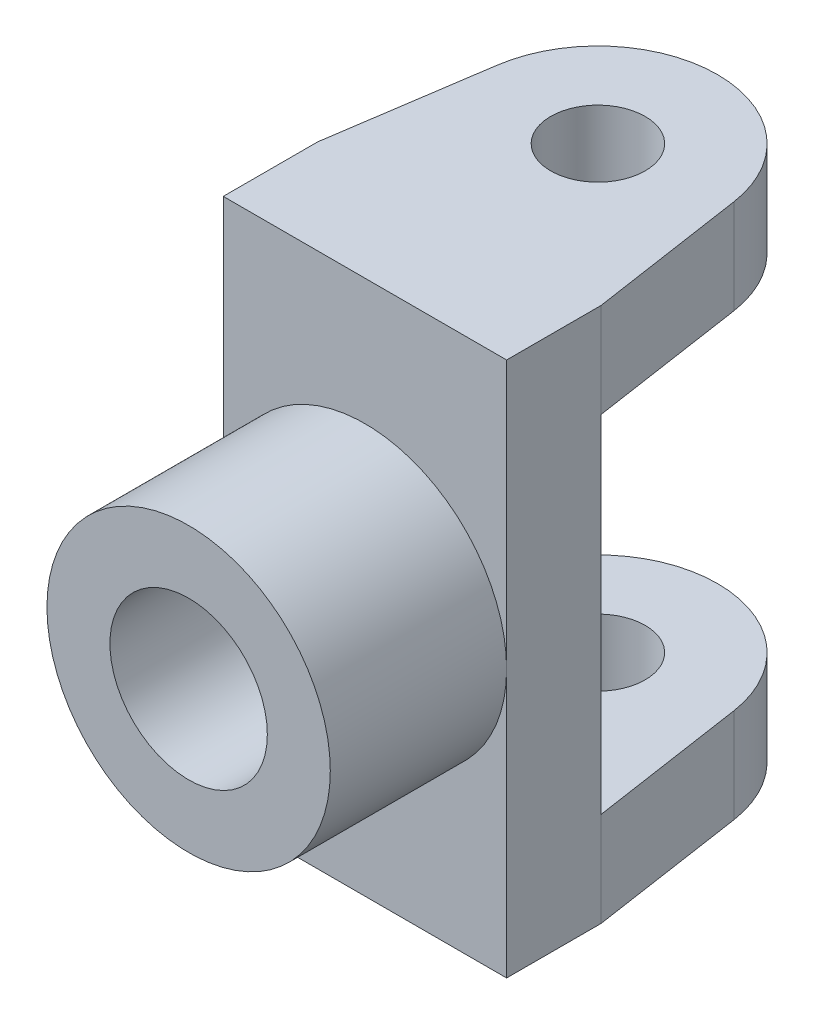
ISO-10303-21;
HEADER;
FILE_DESCRIPTION(('STEP AP214'),'2;1');
FILE_NAME('part.step','',(''),(''),'','','');
FILE_SCHEMA(('AUTOMOTIVE_DESIGN { 1 0 10303 214 1 1 1 1 }'));
ENDSEC;
DATA;
#1=APPLICATION_CONTEXT('core data for automotive mechanical design processes');
#2=APPLICATION_PROTOCOL_DEFINITION('international standard','automotive_design',2000,#1);
#3=PRODUCT_CONTEXT('',#1,'mechanical');
#4=PRODUCT('Part','Part','',(#3));
#5=PRODUCT_RELATED_PRODUCT_CATEGORY('part','',(#4));
#6=PRODUCT_DEFINITION_FORMATION('','',#4);
#7=PRODUCT_DEFINITION_CONTEXT('part definition',#1,'design');
#8=PRODUCT_DEFINITION('design','',#6,#7);
#9=PRODUCT_DEFINITION_SHAPE('','',#8);
#10=(LENGTH_UNIT() NAMED_UNIT(*) SI_UNIT(.MILLI.,.METRE.));
#11=(NAMED_UNIT(*) PLANE_ANGLE_UNIT() SI_UNIT($,.RADIAN.));
#12=(NAMED_UNIT(*) SI_UNIT($,.STERADIAN.) SOLID_ANGLE_UNIT());
#13=UNCERTAINTY_MEASURE_WITH_UNIT(LENGTH_MEASURE(1.E-05),#10,'distance_accuracy_value','');
#14=(GEOMETRIC_REPRESENTATION_CONTEXT(3) GLOBAL_UNCERTAINTY_ASSIGNED_CONTEXT((#13)) GLOBAL_UNIT_ASSIGNED_CONTEXT((#10,
#11,#12)) REPRESENTATION_CONTEXT('',''));
#15=CARTESIAN_POINT('',(0.,0.,0.));
#16=DIRECTION('',(0.,0.,1.));
#17=DIRECTION('',(1.,0.,0.));
#18=AXIS2_PLACEMENT_3D('',#15,#16,#17);
#19=CARTESIAN_POINT('',(0.,0.,-30.));
#20=DIRECTION('',(0.,0.,1.));
#21=DIRECTION('',(1.,0.,0.));
#22=AXIS2_PLACEMENT_3D('',#19,#20,#21);
#23=PLANE('',#22);
#24=DIRECTION('',(-1.,0.,0.));
#25=VECTOR('',#24,1.);
#26=CARTESIAN_POINT('',(-45.,55.,-30.));
#27=LINE('',#26,#25);
#28=CARTESIAN_POINT('',(45.,55.,-30.));
#29=VERTEX_POINT('',#28);
#30=CARTESIAN_POINT('',(-45.,55.,-30.));
#31=VERTEX_POINT('',#30);
#32=EDGE_CURVE('E130',#29,#31,#27,.T.);
#33=ORIENTED_EDGE('',*,*,#32,.F.);
#34=DIRECTION('',(0.,1.,0.));
#35=VECTOR('',#34,1.);
#36=CARTESIAN_POINT('',(45.,85.,-30.));
#37=LINE('',#36,#35);
#38=CARTESIAN_POINT('',(45.,-55.,-30.));
#39=VERTEX_POINT('',#38);
#40=EDGE_CURVE('E152',#39,#29,#37,.T.);
#41=ORIENTED_EDGE('',*,*,#40,.F.);
#42=DIRECTION('',(-1.,0.,0.));
#43=VECTOR('',#42,1.);
#44=CARTESIAN_POINT('',(-45.,-55.,-30.));
#45=LINE('',#44,#43);
#46=CARTESIAN_POINT('',(-45.,-55.,-30.));
#47=VERTEX_POINT('',#46);
#48=EDGE_CURVE('E213',#39,#47,#45,.T.);
#49=ORIENTED_EDGE('',*,*,#48,.T.);
#50=DIRECTION('',(0.,-1.,0.));
#51=VECTOR('',#50,1.);
#52=CARTESIAN_POINT('',(-45.,85.,-30.));
#53=LINE('',#52,#51);
#54=EDGE_CURVE('E57',#31,#47,#53,.T.);
#55=ORIENTED_EDGE('',*,*,#54,.F.);
#56=EDGE_LOOP('',(#33,#41,#49,#55));
#57=FACE_BOUND('',#56,.T.);
#58=ADVANCED_FACE('F39',(#57),#23,.F.);
#59=CARTESIAN_POINT('',(0.,0.,0.));
#60=DIRECTION('',(0.,0.,1.));
#61=DIRECTION('',(1.,0.,0.));
#62=AXIS2_PLACEMENT_3D('',#59,#60,#61);
#63=PLANE('',#62);
#64=CARTESIAN_POINT('',(0.,0.,0.));
#65=DIRECTION('',(0.,0.,1.));
#66=DIRECTION('',(1.,0.,0.));
#67=AXIS2_PLACEMENT_3D('',#64,#65,#66);
#68=CIRCLE('',#67,45.);
#69=CARTESIAN_POINT('',(45.,0.,0.));
#70=VERTEX_POINT('',#69);
#71=CARTESIAN_POINT('',(-45.,0.,0.));
#72=VERTEX_POINT('',#71);
#73=EDGE_CURVE('E50',#70,#72,#68,.T.);
#74=ORIENTED_EDGE('',*,*,#73,.F.);
#75=DIRECTION('',(0.,1.,0.));
#76=VECTOR('',#75,1.);
#77=CARTESIAN_POINT('',(45.,85.,0.));
#78=LINE('',#77,#76);
#79=CARTESIAN_POINT('',(45.,85.,0.));
#80=VERTEX_POINT('',#79);
#81=EDGE_CURVE('E171',#70,#80,#78,.T.);
#82=ORIENTED_EDGE('',*,*,#81,.T.);
#83=DIRECTION('',(-1.,0.,0.));
#84=VECTOR('',#83,1.);
#85=CARTESIAN_POINT('',(-45.,85.,0.));
#86=LINE('',#85,#84);
#87=CARTESIAN_POINT('',(-45.,85.,0.));
#88=VERTEX_POINT('',#87);
#89=EDGE_CURVE('E170',#80,#88,#86,.T.);
#90=ORIENTED_EDGE('',*,*,#89,.T.);
#91=DIRECTION('',(0.,-1.,0.));
#92=VECTOR('',#91,1.);
#93=CARTESIAN_POINT('',(-45.,85.,0.));
#94=LINE('',#93,#92);
#95=EDGE_CURVE('E162',#88,#72,#94,.T.);
#96=ORIENTED_EDGE('',*,*,#95,.T.);
#97=EDGE_LOOP('',(#74,#82,#90,#96));
#98=FACE_BOUND('',#97,.T.);
#99=ADVANCED_FACE('F190',(#98),#63,.T.);
#100=CARTESIAN_POINT('',(45.,85.,-30.));
#101=DIRECTION('',(1.,0.,0.));
#102=DIRECTION('',(0.,1.,0.));
#103=AXIS2_PLACEMENT_3D('',#100,#101,#102);
#104=PLANE('',#103);
#105=CARTESIAN_POINT('',(45.,-85.,0.));
#106=VERTEX_POINT('',#105);
#107=EDGE_CURVE('E168',#106,#70,#78,.T.);
#108=ORIENTED_EDGE('',*,*,#107,.F.);
#109=DIRECTION('',(0.,0.,1.));
#110=VECTOR('',#109,1.);
#111=CARTESIAN_POINT('',(45.,-85.,-30.));
#112=LINE('',#111,#110);
#113=CARTESIAN_POINT('',(45.,-85.,-30.));
#114=VERTEX_POINT('',#113);
#115=EDGE_CURVE('E48',#114,#106,#112,.T.);
#116=ORIENTED_EDGE('',*,*,#115,.F.);
#117=EDGE_CURVE('E158',#114,#39,#37,.T.);
#118=ORIENTED_EDGE('',*,*,#117,.T.);
#119=ORIENTED_EDGE('',*,*,#40,.T.);
#120=DIRECTION('',(0.,1.,0.));
#121=VECTOR('',#120,1.);
#122=CARTESIAN_POINT('',(45.,55.,-30.));
#123=LINE('',#122,#121);
#124=CARTESIAN_POINT('',(45.,85.,-30.));
#125=VERTEX_POINT('',#124);
#126=EDGE_CURVE('E138',#29,#125,#123,.T.);
#127=ORIENTED_EDGE('',*,*,#126,.T.);
#128=DIRECTION('',(0.,0.,1.));
#129=VECTOR('',#128,1.);
#130=CARTESIAN_POINT('',(45.,85.,-30.));
#131=LINE('',#130,#129);
#132=EDGE_CURVE('E43',#125,#80,#131,.T.);
#133=ORIENTED_EDGE('',*,*,#132,.T.);
#134=ORIENTED_EDGE('',*,*,#81,.F.);
#135=EDGE_LOOP('',(#108,#116,#118,#119,#127,#133,#134));
#136=FACE_BOUND('',#135,.T.);
#137=ADVANCED_FACE('F41',(#136),#104,.T.);
#138=CARTESIAN_POINT('',(-45.,-85.,-30.));
#139=DIRECTION('',(0.,-1.,0.));
#140=DIRECTION('',(0.,0.,-1.));
#141=AXIS2_PLACEMENT_3D('',#138,#139,#140);
#142=PLANE('',#141);
#143=DIRECTION('',(1.,0.,0.));
#144=VECTOR('',#143,1.);
#145=CARTESIAN_POINT('',(-45.,-85.,0.));
#146=LINE('',#145,#144);
#147=CARTESIAN_POINT('',(-45.,-85.,0.));
#148=VERTEX_POINT('',#147);
#149=EDGE_CURVE('E159',#148,#106,#146,.T.);
#150=ORIENTED_EDGE('',*,*,#149,.F.);
#151=DIRECTION('',(0.,0.,1.));
#152=VECTOR('',#151,1.);
#153=CARTESIAN_POINT('',(-45.,-85.,-30.));
#154=LINE('',#153,#152);
#155=CARTESIAN_POINT('',(-45.,-85.,-30.));
#156=VERTEX_POINT('',#155);
#157=EDGE_CURVE('E178',#156,#148,#154,.T.);
#158=ORIENTED_EDGE('',*,*,#157,.F.);
#159=DIRECTION('',(0.147850805107289,0.,-0.989009676104904));
#160=VECTOR('',#159,1.);
#161=CARTESIAN_POINT('',(-45.,-85.,-30.));
#162=LINE('',#161,#160);
#163=CARTESIAN_POINT('',(-37.5823676919863,-85.,-79.618330594077));
#164=VERTEX_POINT('',#163);
#165=EDGE_CURVE('E217',#156,#164,#162,.T.);
#166=ORIENTED_EDGE('',*,*,#165,.T.);
#167=CARTESIAN_POINT('',(0.,-85.,-74.));
#168=DIRECTION('',(0.,-1.,0.));
#169=DIRECTION('',(0.,0.,-1.));
#170=AXIS2_PLACEMENT_3D('',#167,#168,#169);
#171=CIRCLE('',#170,38.);
#172=CARTESIAN_POINT('',(37.5823676919864,-85.,-79.6183305940769));
#173=VERTEX_POINT('',#172);
#174=EDGE_CURVE('E214',#164,#173,#171,.T.);
#175=ORIENTED_EDGE('',*,*,#174,.T.);
#176=DIRECTION('',(0.147850805107287,0.,0.989009676104904));
#177=VECTOR('',#176,1.);
#178=CARTESIAN_POINT('',(45.,-85.,-30.));
#179=LINE('',#178,#177);
#180=EDGE_CURVE('E210',#173,#114,#179,.T.);
#181=ORIENTED_EDGE('',*,*,#180,.T.);
#182=ORIENTED_EDGE('',*,*,#115,.T.);
#183=EDGE_LOOP('',(#150,#158,#166,#175,#181,#182));
#184=FACE_BOUND('',#183,.T.);
#185=CARTESIAN_POINT('',(0.,-85.,-74.));
#186=DIRECTION('',(0.,-1.,0.));
#187=DIRECTION('',(0.,0.,-1.));
#188=AXIS2_PLACEMENT_3D('',#185,#186,#187);
#189=CIRCLE('',#188,15.);
#190=CARTESIAN_POINT('',(0.,-85.,-89.));
#191=VERTEX_POINT('',#190);
#192=EDGE_CURVE('E230',#191,#191,#189,.T.);
#193=ORIENTED_EDGE('',*,*,#192,.F.);
#194=EDGE_LOOP('',(#193));
#195=FACE_BOUND('',#194,.T.);
#196=ADVANCED_FACE('F285',(#184,#195),#142,.T.);
#197=CARTESIAN_POINT('',(-45.,85.,-30.));
#198=DIRECTION('',(-1.,0.,0.));
#199=DIRECTION('',(0.,-1.,0.));
#200=AXIS2_PLACEMENT_3D('',#197,#198,#199);
#201=PLANE('',#200);
#202=ORIENTED_EDGE('',*,*,#95,.F.);
#203=DIRECTION('',(0.,0.,1.));
#204=VECTOR('',#203,1.);
#205=CARTESIAN_POINT('',(-45.,85.,-30.));
#206=LINE('',#205,#204);
#207=CARTESIAN_POINT('',(-45.,85.,-30.));
#208=VERTEX_POINT('',#207);
#209=EDGE_CURVE('E180',#208,#88,#206,.T.);
#210=ORIENTED_EDGE('',*,*,#209,.F.);
#211=EDGE_CURVE('E166',#208,#31,#53,.T.);
#212=ORIENTED_EDGE('',*,*,#211,.T.);
#213=ORIENTED_EDGE('',*,*,#54,.T.);
#214=DIRECTION('',(0.,-1.,0.));
#215=VECTOR('',#214,1.);
#216=CARTESIAN_POINT('',(-45.,-55.,-30.));
#217=LINE('',#216,#215);
#218=EDGE_CURVE('E204',#47,#156,#217,.T.);
#219=ORIENTED_EDGE('',*,*,#218,.T.);
#220=ORIENTED_EDGE('',*,*,#157,.T.);
#221=EDGE_CURVE('E174',#72,#148,#94,.T.);
#222=ORIENTED_EDGE('',*,*,#221,.F.);
#223=EDGE_LOOP('',(#202,#210,#212,#213,#219,#220,#222));
#224=FACE_BOUND('',#223,.T.);
#225=ADVANCED_FACE('F288',(#224),#201,.T.);
#226=CARTESIAN_POINT('',(-45.,85.,-30.));
#227=DIRECTION('',(0.,1.,0.));
#228=DIRECTION('',(0.,0.,1.));
#229=AXIS2_PLACEMENT_3D('',#226,#227,#228);
#230=PLANE('',#229);
#231=ORIENTED_EDGE('',*,*,#89,.F.);
#232=ORIENTED_EDGE('',*,*,#132,.F.);
#233=DIRECTION('',(0.147850805107287,0.,0.989009676104904));
#234=VECTOR('',#233,1.);
#235=CARTESIAN_POINT('',(45.,85.,-30.));
#236=LINE('',#235,#234);
#237=CARTESIAN_POINT('',(37.5823676919864,85.,-79.6183305940769));
#238=VERTEX_POINT('',#237);
#239=EDGE_CURVE('E141',#238,#125,#236,.T.);
#240=ORIENTED_EDGE('',*,*,#239,.F.);
#241=CARTESIAN_POINT('',(0.,85.,-74.));
#242=DIRECTION('',(0.,-1.,0.));
#243=DIRECTION('',(0.,0.,-1.));
#244=AXIS2_PLACEMENT_3D('',#241,#242,#243);
#245=CIRCLE('',#244,38.);
#246=CARTESIAN_POINT('',(-37.5823676919863,85.,-79.618330594077));
#247=VERTEX_POINT('',#246);
#248=EDGE_CURVE('E240',#247,#238,#245,.T.);
#249=ORIENTED_EDGE('',*,*,#248,.F.);
#250=DIRECTION('',(0.147850805107289,0.,-0.989009676104904));
#251=VECTOR('',#250,1.);
#252=CARTESIAN_POINT('',(-45.,85.,-30.));
#253=LINE('',#252,#251);
#254=EDGE_CURVE('E154',#208,#247,#253,.T.);
#255=ORIENTED_EDGE('',*,*,#254,.F.);
#256=ORIENTED_EDGE('',*,*,#209,.T.);
#257=EDGE_LOOP('',(#231,#232,#240,#249,#255,#256));
#258=FACE_BOUND('',#257,.T.);
#259=CARTESIAN_POINT('',(0.,85.,-74.));
#260=DIRECTION('',(0.,-1.,0.));
#261=DIRECTION('',(0.,0.,-1.));
#262=AXIS2_PLACEMENT_3D('',#259,#260,#261);
#263=CIRCLE('',#262,15.);
#264=CARTESIAN_POINT('',(0.,85.,-89.));
#265=VERTEX_POINT('',#264);
#266=EDGE_CURVE('E246',#265,#265,#263,.T.);
#267=ORIENTED_EDGE('',*,*,#266,.T.);
#268=EDGE_LOOP('',(#267));
#269=FACE_BOUND('',#268,.T.);
#270=ADVANCED_FACE('F187',(#258,#269),#230,.T.);
#271=EDGE_CURVE('E11',#72,#70,#68,.T.);
#272=ORIENTED_EDGE('',*,*,#271,.F.);
#273=ORIENTED_EDGE('',*,*,#221,.T.);
#274=ORIENTED_EDGE('',*,*,#149,.T.);
#275=ORIENTED_EDGE('',*,*,#107,.T.);
#276=EDGE_LOOP('',(#272,#273,#274,#275));
#277=FACE_BOUND('',#276,.T.);
#278=ADVANCED_FACE('F278',(#277),#63,.T.);
#279=CARTESIAN_POINT('',(0.,0.,56.));
#280=DIRECTION('',(0.,0.,1.));
#281=DIRECTION('',(1.,0.,0.));
#282=AXIS2_PLACEMENT_3D('',#279,#280,#281);
#283=PLANE('',#282);
#284=CARTESIAN_POINT('',(0.,0.,56.));
#285=DIRECTION('',(0.,0.,1.));
#286=DIRECTION('',(1.,0.,0.));
#287=AXIS2_PLACEMENT_3D('',#284,#285,#286);
#288=CIRCLE('',#287,45.);
#289=CARTESIAN_POINT('',(45.,0.,56.));
#290=VERTEX_POINT('',#289);
#291=EDGE_CURVE('E192',#290,#290,#288,.T.);
#292=ORIENTED_EDGE('',*,*,#291,.T.);
#293=EDGE_LOOP('',(#292));
#294=FACE_BOUND('',#293,.T.);
#295=CARTESIAN_POINT('',(0.,0.,56.));
#296=DIRECTION('',(0.,0.,1.));
#297=DIRECTION('',(1.,0.,0.));
#298=AXIS2_PLACEMENT_3D('',#295,#296,#297);
#299=CIRCLE('',#298,25.);
#300=CARTESIAN_POINT('',(25.,0.,56.));
#301=VERTEX_POINT('',#300);
#302=EDGE_CURVE('E196',#301,#301,#299,.T.);
#303=ORIENTED_EDGE('',*,*,#302,.F.);
#304=EDGE_LOOP('',(#303));
#305=FACE_BOUND('',#304,.T.);
#306=ADVANCED_FACE('F284',(#294,#305),#283,.T.);
#307=CARTESIAN_POINT('',(0.,0.,56.));
#308=DIRECTION('',(0.,0.,-1.));
#309=DIRECTION('',(-1.,0.,0.));
#310=AXIS2_PLACEMENT_3D('',#307,#308,#309);
#311=CYLINDRICAL_SURFACE('',#310,45.);
#312=ORIENTED_EDGE('',*,*,#291,.F.);
#313=EDGE_LOOP('',(#312));
#314=FACE_BOUND('',#313,.T.);
#315=ORIENTED_EDGE('',*,*,#73,.T.);
#316=ORIENTED_EDGE('',*,*,#271,.T.);
#317=EDGE_LOOP('',(#315,#316));
#318=FACE_BOUND('',#317,.T.);
#319=ADVANCED_FACE('F280',(#314,#318),#311,.T.);
#320=CARTESIAN_POINT('',(0.,0.,56.));
#321=DIRECTION('',(0.,0.,-1.));
#322=DIRECTION('',(-1.,0.,0.));
#323=AXIS2_PLACEMENT_3D('',#320,#321,#322);
#324=CYLINDRICAL_SURFACE('',#323,25.);
#325=ORIENTED_EDGE('',*,*,#302,.T.);
#326=EDGE_LOOP('',(#325));
#327=FACE_BOUND('',#326,.T.);
#328=CARTESIAN_POINT('',(0.,0.,0.));
#329=DIRECTION('',(0.,0.,1.));
#330=DIRECTION('',(1.,0.,0.));
#331=AXIS2_PLACEMENT_3D('',#328,#329,#330);
#332=CIRCLE('',#331,25.);
#333=CARTESIAN_POINT('',(25.,0.,0.));
#334=VERTEX_POINT('',#333);
#335=EDGE_CURVE('E198',#334,#334,#332,.T.);
#336=ORIENTED_EDGE('',*,*,#335,.F.);
#337=EDGE_LOOP('',(#336));
#338=FACE_BOUND('',#337,.T.);
#339=ADVANCED_FACE('F321',(#327,#338),#324,.F.);
#340=ORIENTED_EDGE('',*,*,#335,.T.);
#341=EDGE_LOOP('',(#340));
#342=FACE_BOUND('',#341,.T.);
#343=ADVANCED_FACE('F277',(#342),#63,.T.);
#344=CARTESIAN_POINT('',(45.,-55.,-30.));
#345=DIRECTION('',(0.989009676104904,0.,-0.147850805107287));
#346=DIRECTION('',(-0.147850805107287,0.,-0.989009676104904));
#347=AXIS2_PLACEMENT_3D('',#344,#345,#346);
#348=PLANE('',#347);
#349=ORIENTED_EDGE('',*,*,#180,.F.);
#350=DIRECTION('',(0.,-1.,0.));
#351=VECTOR('',#350,1.);
#352=CARTESIAN_POINT('',(37.5823676919864,-55.,-79.6183305940769));
#353=LINE('',#352,#351);
#354=CARTESIAN_POINT('',(37.5823676919864,-55.,-79.6183305940769));
#355=VERTEX_POINT('',#354);
#356=EDGE_CURVE('E201',#355,#173,#353,.T.);
#357=ORIENTED_EDGE('',*,*,#356,.F.);
#358=DIRECTION('',(0.147850805107287,0.,0.989009676104904));
#359=VECTOR('',#358,1.);
#360=CARTESIAN_POINT('',(45.,-55.,-30.));
#361=LINE('',#360,#359);
#362=EDGE_CURVE('E207',#355,#39,#361,.T.);
#363=ORIENTED_EDGE('',*,*,#362,.T.);
#364=ORIENTED_EDGE('',*,*,#117,.F.);
#365=EDGE_LOOP('',(#349,#357,#363,#364));
#366=FACE_BOUND('',#365,.T.);
#367=ADVANCED_FACE('F327',(#366),#348,.T.);
#368=CARTESIAN_POINT('',(0.,-55.,-74.));
#369=DIRECTION('',(0.,-1.,0.));
#370=DIRECTION('',(0.,0.,-1.));
#371=AXIS2_PLACEMENT_3D('',#368,#369,#370);
#372=CYLINDRICAL_SURFACE('',#371,38.);
#373=ORIENTED_EDGE('',*,*,#174,.F.);
#374=DIRECTION('',(0.,-1.,0.));
#375=VECTOR('',#374,1.);
#376=CARTESIAN_POINT('',(-37.5823676919863,-55.,-79.618330594077));
#377=LINE('',#376,#375);
#378=CARTESIAN_POINT('',(-37.5823676919863,-55.,-79.618330594077));
#379=VERTEX_POINT('',#378);
#380=EDGE_CURVE('E206',#379,#164,#377,.T.);
#381=ORIENTED_EDGE('',*,*,#380,.F.);
#382=CARTESIAN_POINT('',(0.,-55.,-74.));
#383=DIRECTION('',(0.,-1.,0.));
#384=DIRECTION('',(0.,0.,-1.));
#385=AXIS2_PLACEMENT_3D('',#382,#383,#384);
#386=CIRCLE('',#385,38.);
#387=EDGE_CURVE('E223',#379,#355,#386,.T.);
#388=ORIENTED_EDGE('',*,*,#387,.T.);
#389=ORIENTED_EDGE('',*,*,#356,.T.);
#390=EDGE_LOOP('',(#373,#381,#388,#389));
#391=FACE_BOUND('',#390,.T.);
#392=ADVANCED_FACE('F332',(#391),#372,.T.);
#393=CARTESIAN_POINT('',(-45.,-55.,-30.));
#394=DIRECTION('',(-0.989009676104904,0.,-0.147850805107289));
#395=DIRECTION('',(-0.147850805107289,0.,0.989009676104904));
#396=AXIS2_PLACEMENT_3D('',#393,#394,#395);
#397=PLANE('',#396);
#398=ORIENTED_EDGE('',*,*,#165,.F.);
#399=ORIENTED_EDGE('',*,*,#218,.F.);
#400=DIRECTION('',(0.147850805107289,0.,-0.989009676104904));
#401=VECTOR('',#400,1.);
#402=CARTESIAN_POINT('',(-45.,-55.,-30.));
#403=LINE('',#402,#401);
#404=EDGE_CURVE('E226',#47,#379,#403,.T.);
#405=ORIENTED_EDGE('',*,*,#404,.T.);
#406=ORIENTED_EDGE('',*,*,#380,.T.);
#407=EDGE_LOOP('',(#398,#399,#405,#406));
#408=FACE_BOUND('',#407,.T.);
#409=ADVANCED_FACE('F342',(#408),#397,.T.);
#410=CARTESIAN_POINT('',(0.,-55.,-74.));
#411=DIRECTION('',(0.,-1.,0.));
#412=DIRECTION('',(0.,0.,-1.));
#413=AXIS2_PLACEMENT_3D('',#410,#411,#412);
#414=PLANE('',#413);
#415=CARTESIAN_POINT('',(0.,-55.,-74.));
#416=DIRECTION('',(0.,-1.,0.));
#417=DIRECTION('',(0.,0.,-1.));
#418=AXIS2_PLACEMENT_3D('',#415,#416,#417);
#419=CIRCLE('',#418,15.);
#420=CARTESIAN_POINT('',(0.,-55.,-89.));
#421=VERTEX_POINT('',#420);
#422=EDGE_CURVE('E220',#421,#421,#419,.T.);
#423=ORIENTED_EDGE('',*,*,#422,.T.);
#424=EDGE_LOOP('',(#423));
#425=FACE_BOUND('',#424,.T.);
#426=ORIENTED_EDGE('',*,*,#48,.F.);
#427=ORIENTED_EDGE('',*,*,#362,.F.);
#428=ORIENTED_EDGE('',*,*,#387,.F.);
#429=ORIENTED_EDGE('',*,*,#404,.F.);
#430=EDGE_LOOP('',(#426,#427,#428,#429));
#431=FACE_BOUND('',#430,.T.);
#432=ADVANCED_FACE('F266',(#425,#431),#414,.F.);
#433=CARTESIAN_POINT('',(0.,-55.,-74.));
#434=DIRECTION('',(0.,-1.,0.));
#435=DIRECTION('',(0.,0.,-1.));
#436=AXIS2_PLACEMENT_3D('',#433,#434,#435);
#437=CYLINDRICAL_SURFACE('',#436,15.);
#438=ORIENTED_EDGE('',*,*,#422,.F.);
#439=EDGE_LOOP('',(#438));
#440=FACE_BOUND('',#439,.T.);
#441=ORIENTED_EDGE('',*,*,#192,.T.);
#442=EDGE_LOOP('',(#441));
#443=FACE_BOUND('',#442,.T.);
#444=ADVANCED_FACE('F256',(#440,#443),#437,.F.);
#445=CARTESIAN_POINT('',(0.,55.,-74.));
#446=DIRECTION('',(0.,1.,0.));
#447=DIRECTION('',(0.,0.,-1.));
#448=AXIS2_PLACEMENT_3D('',#445,#446,#447);
#449=PLANE('',#448);
#450=ORIENTED_EDGE('',*,*,#32,.T.);
#451=DIRECTION('',(0.147850805107289,0.,-0.989009676104904));
#452=VECTOR('',#451,1.);
#453=CARTESIAN_POINT('',(-45.,55.,-30.));
#454=LINE('',#453,#452);
#455=CARTESIAN_POINT('',(-37.5823676919863,55.,-79.618330594077));
#456=VERTEX_POINT('',#455);
#457=EDGE_CURVE('E147',#31,#456,#454,.T.);
#458=ORIENTED_EDGE('',*,*,#457,.T.);
#459=CARTESIAN_POINT('',(0.,55.,-74.));
#460=DIRECTION('',(0.,-1.,0.));
#461=DIRECTION('',(0.,0.,-1.));
#462=AXIS2_PLACEMENT_3D('',#459,#460,#461);
#463=CIRCLE('',#462,38.);
#464=CARTESIAN_POINT('',(37.5823676919864,55.,-79.6183305940769));
#465=VERTEX_POINT('',#464);
#466=EDGE_CURVE('E132',#456,#465,#463,.T.);
#467=ORIENTED_EDGE('',*,*,#466,.T.);
#468=DIRECTION('',(0.147850805107287,0.,0.989009676104904));
#469=VECTOR('',#468,1.);
#470=CARTESIAN_POINT('',(45.,55.,-30.));
#471=LINE('',#470,#469);
#472=EDGE_CURVE('E125',#465,#29,#471,.T.);
#473=ORIENTED_EDGE('',*,*,#472,.T.);
#474=EDGE_LOOP('',(#450,#458,#467,#473));
#475=FACE_BOUND('',#474,.T.);
#476=CARTESIAN_POINT('',(0.,55.,-74.));
#477=DIRECTION('',(0.,-1.,0.));
#478=DIRECTION('',(0.,0.,-1.));
#479=AXIS2_PLACEMENT_3D('',#476,#477,#478);
#480=CIRCLE('',#479,15.);
#481=CARTESIAN_POINT('',(0.,55.,-89.));
#482=VERTEX_POINT('',#481);
#483=EDGE_CURVE('E243',#482,#482,#480,.T.);
#484=ORIENTED_EDGE('',*,*,#483,.F.);
#485=EDGE_LOOP('',(#484));
#486=FACE_BOUND('',#485,.T.);
#487=ADVANCED_FACE('F127',(#475,#486),#449,.F.);
#488=CARTESIAN_POINT('',(-45.,55.,-30.));
#489=DIRECTION('',(0.989009676104904,0.,0.147850805107289));
#490=DIRECTION('',(0.147850805107289,0.,-0.989009676104904));
#491=AXIS2_PLACEMENT_3D('',#488,#489,#490);
#492=PLANE('',#491);
#493=ORIENTED_EDGE('',*,*,#254,.T.);
#494=DIRECTION('',(0.,1.,0.));
#495=VECTOR('',#494,1.);
#496=CARTESIAN_POINT('',(-37.5823676919863,55.,-79.618330594077));
#497=LINE('',#496,#495);
#498=EDGE_CURVE('E233',#456,#247,#497,.T.);
#499=ORIENTED_EDGE('',*,*,#498,.F.);
#500=ORIENTED_EDGE('',*,*,#457,.F.);
#501=ORIENTED_EDGE('',*,*,#211,.F.);
#502=EDGE_LOOP('',(#493,#499,#500,#501));
#503=FACE_BOUND('',#502,.T.);
#504=ADVANCED_FACE('F255',(#503),#492,.F.);
#505=CARTESIAN_POINT('',(0.,55.,-74.));
#506=DIRECTION('',(0.,1.,0.));
#507=DIRECTION('',(0.,0.,1.));
#508=AXIS2_PLACEMENT_3D('',#505,#506,#507);
#509=CYLINDRICAL_SURFACE('',#508,38.);
#510=ORIENTED_EDGE('',*,*,#248,.T.);
#511=DIRECTION('',(0.,1.,0.));
#512=VECTOR('',#511,1.);
#513=CARTESIAN_POINT('',(37.5823676919864,55.,-79.6183305940769));
#514=LINE('',#513,#512);
#515=EDGE_CURVE('E146',#465,#238,#514,.T.);
#516=ORIENTED_EDGE('',*,*,#515,.F.);
#517=ORIENTED_EDGE('',*,*,#466,.F.);
#518=ORIENTED_EDGE('',*,*,#498,.T.);
#519=EDGE_LOOP('',(#510,#516,#517,#518));
#520=FACE_BOUND('',#519,.T.);
#521=ADVANCED_FACE('F262',(#520),#509,.T.);
#522=CARTESIAN_POINT('',(45.,55.,-30.));
#523=DIRECTION('',(-0.989009676104904,0.,0.147850805107287));
#524=DIRECTION('',(0.147850805107287,0.,0.989009676104904));
#525=AXIS2_PLACEMENT_3D('',#522,#523,#524);
#526=PLANE('',#525);
#527=ORIENTED_EDGE('',*,*,#239,.T.);
#528=ORIENTED_EDGE('',*,*,#126,.F.);
#529=ORIENTED_EDGE('',*,*,#472,.F.);
#530=ORIENTED_EDGE('',*,*,#515,.T.);
#531=EDGE_LOOP('',(#527,#528,#529,#530));
#532=FACE_BOUND('',#531,.T.);
#533=ADVANCED_FACE('F139',(#532),#526,.F.);
#534=CARTESIAN_POINT('',(0.,55.,-74.));
#535=DIRECTION('',(0.,1.,0.));
#536=DIRECTION('',(0.,0.,1.));
#537=AXIS2_PLACEMENT_3D('',#534,#535,#536);
#538=CYLINDRICAL_SURFACE('',#537,15.);
#539=ORIENTED_EDGE('',*,*,#483,.T.);
#540=EDGE_LOOP('',(#539));
#541=FACE_BOUND('',#540,.T.);
#542=ORIENTED_EDGE('',*,*,#266,.F.);
#543=EDGE_LOOP('',(#542));
#544=FACE_BOUND('',#543,.T.);
#545=ADVANCED_FACE('F252',(#541,#544),#538,.F.);
#546=CLOSED_SHELL('',(#58,#99,#137,#196,#225,#270,#278,#306,#319,#339,#343,#367,#392,#409,#432,
#444,#487,#504,#521,#533,#545));
#547=MANIFOLD_SOLID_BREP('B2',#546);
#548=ADVANCED_BREP_SHAPE_REPRESENTATION('',(#18,#547),#14);
#549=SHAPE_DEFINITION_REPRESENTATION(#9,#548);
ENDSEC;
END-ISO-10303-21;
